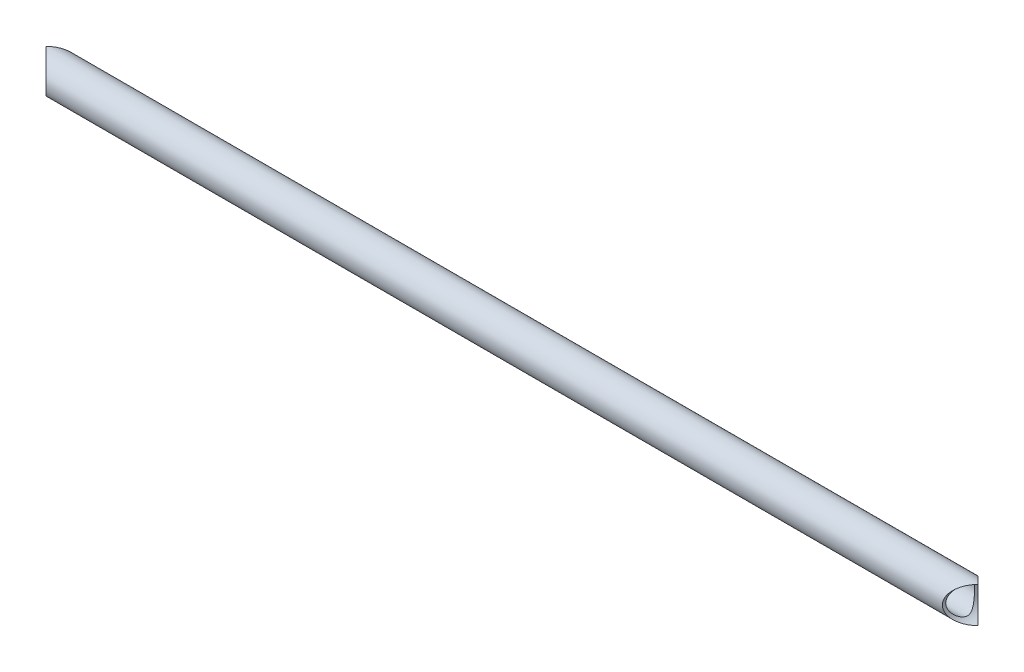
ISO-10303-21;
HEADER;
FILE_DESCRIPTION(('STEP AP214'),'2;1');
FILE_NAME('part.step','',(''),(''),'','','');
FILE_SCHEMA(('AUTOMOTIVE_DESIGN { 1 0 10303 214 1 1 1 1 }'));
ENDSEC;
DATA;
#1=APPLICATION_CONTEXT('core data for automotive mechanical design processes');
#2=APPLICATION_PROTOCOL_DEFINITION('international standard','automotive_design',2000,#1);
#3=PRODUCT_CONTEXT('',#1,'mechanical');
#4=PRODUCT('Part','Part','',(#3));
#5=PRODUCT_RELATED_PRODUCT_CATEGORY('part','',(#4));
#6=PRODUCT_DEFINITION_FORMATION('','',#4);
#7=PRODUCT_DEFINITION_CONTEXT('part definition',#1,'design');
#8=PRODUCT_DEFINITION('design','',#6,#7);
#9=PRODUCT_DEFINITION_SHAPE('','',#8);
#10=(LENGTH_UNIT() NAMED_UNIT(*) SI_UNIT(.MILLI.,.METRE.));
#11=(NAMED_UNIT(*) PLANE_ANGLE_UNIT() SI_UNIT($,.RADIAN.));
#12=(NAMED_UNIT(*) SI_UNIT($,.STERADIAN.) SOLID_ANGLE_UNIT());
#13=UNCERTAINTY_MEASURE_WITH_UNIT(LENGTH_MEASURE(1.E-05),#10,'distance_accuracy_value','');
#14=(GEOMETRIC_REPRESENTATION_CONTEXT(3) GLOBAL_UNCERTAINTY_ASSIGNED_CONTEXT((#13)) GLOBAL_UNIT_ASSIGNED_CONTEXT((#10,
#11,#12)) REPRESENTATION_CONTEXT('',''));
#15=CARTESIAN_POINT('',(0.,0.,0.));
#16=DIRECTION('',(0.,0.,1.));
#17=DIRECTION('',(1.,0.,0.));
#18=AXIS2_PLACEMENT_3D('',#15,#16,#17);
#19=CARTESIAN_POINT('',(473.575059000242,250.,150.));
#20=DIRECTION('',(-1.,0.,0.));
#21=DIRECTION('',(0.,0.,1.));
#22=AXIS2_PLACEMENT_3D('',#19,#20,#21);
#23=CYLINDRICAL_SURFACE('',#22,7.93750000000001);
#24=CARTESIAN_POINT('',(58.5315782487256,250.,150.));
#25=DIRECTION('',(-0.707106781186548,0.,0.707106781186547));
#26=DIRECTION('',(-0.707106781186547,0.,-0.707106781186547));
#27=AXIS2_PLACEMENT_3D('',#24,#25,#26);
#28=ELLIPSE('',#27,11.2253201513364,7.9375);
#29=CARTESIAN_POINT('',(58.5315782487256,242.0625,150.));
#30=VERTEX_POINT('',#29);
#31=CARTESIAN_POINT('',(58.5315782487256,257.9375,150.));
#32=VERTEX_POINT('',#31);
#33=EDGE_CURVE('E72',#30,#32,#28,.T.);
#34=ORIENTED_EDGE('',*,*,#33,.F.);
#35=CARTESIAN_POINT('',(58.5315782487256,250.,150.));
#36=DIRECTION('',(-0.707106781186547,0.,-0.707106781186547));
#37=DIRECTION('',(-0.707106781186548,0.,0.707106781186547));
#38=AXIS2_PLACEMENT_3D('',#35,#36,#37);
#39=ELLIPSE('',#38,11.2253201513364,7.9375);
#40=EDGE_CURVE('E75',#32,#30,#39,.T.);
#41=ORIENTED_EDGE('',*,*,#40,.F.);
#42=EDGE_LOOP('',(#34,#41));
#43=FACE_BOUND('',#42,.T.);
#44=CARTESIAN_POINT('',(473.575059000242,250.,150.));
#45=DIRECTION('',(-0.707106781186547,0.,-0.707106781186547));
#46=DIRECTION('',(-0.707106781186548,0.,0.707106781186547));
#47=AXIS2_PLACEMENT_3D('',#44,#45,#46);
#48=ELLIPSE('',#47,11.2253201513364,7.93749999999999);
#49=CARTESIAN_POINT('',(473.575059000242,257.9375,150.));
#50=VERTEX_POINT('',#49);
#51=CARTESIAN_POINT('',(473.575059000242,242.0625,150.));
#52=VERTEX_POINT('',#51);
#53=EDGE_CURVE('E56',#50,#52,#48,.F.);
#54=ORIENTED_EDGE('',*,*,#53,.F.);
#55=CARTESIAN_POINT('',(473.575059000242,250.,150.));
#56=DIRECTION('',(-0.707106781186548,0.,0.707106781186547));
#57=DIRECTION('',(-0.707106781186547,0.,-0.707106781186547));
#58=AXIS2_PLACEMENT_3D('',#55,#56,#57);
#59=ELLIPSE('',#58,11.2253201513364,7.93749999999999);
#60=EDGE_CURVE('E64',#52,#50,#59,.F.);
#61=ORIENTED_EDGE('',*,*,#60,.F.);
#62=EDGE_LOOP('',(#54,#61));
#63=FACE_BOUND('',#62,.T.);
#64=ADVANCED_FACE('F43',(#43,#63),#23,.T.);
#65=CARTESIAN_POINT('',(58.5315782487256,250.,142.0625));
#66=DIRECTION('',(0.,0.,-1.));
#67=DIRECTION('',(-1.,0.,0.));
#68=AXIS2_PLACEMENT_3D('',#65,#66,#67);
#69=CYLINDRICAL_SURFACE('',#68,7.93749999999999);
#70=CARTESIAN_POINT('',(66.4690782487256,250.,156.4375));
#71=CARTESIAN_POINT('',(66.4690788460228,250.154053503878,156.437500608444));
#72=CARTESIAN_POINT('',(66.4645847339768,250.308099275992,156.431961861972));
#73=CARTESIAN_POINT('',(66.4467142619706,250.614941540752,156.409907964997));
#74=CARTESIAN_POINT('',(66.433334556245,250.767737540864,156.393388679899));
#75=CARTESIAN_POINT('',(66.3979815952464,251.070948446745,156.349643097306));
#76=CARTESIAN_POINT('',(66.3759986966101,251.221360482769,156.322404784608));
#77=CARTESIAN_POINT('',(66.3239195371053,251.518586125078,156.257671431219));
#78=CARTESIAN_POINT('',(66.2938195983297,251.665398067148,156.220171740889));
#79=CARTESIAN_POINT('',(66.2263602235137,251.953449267325,156.135781077952));
#80=CARTESIAN_POINT('',(66.1890511531619,252.094719448489,156.088955195595));
#81=CARTESIAN_POINT('',(66.1077471609762,252.372022320857,155.986385089181));
#82=CARTESIAN_POINT('',(66.0637493244889,252.508052696251,155.930636976669));
#83=CARTESIAN_POINT('',(65.9228539220107,252.907302010115,155.75100221247));
#84=CARTESIAN_POINT('',(65.8169932228406,253.16193206833,155.614649482006));
#85=CARTESIAN_POINT('',(65.6247658528365,253.567010929785,155.362381999194));
#86=CARTESIAN_POINT('',(65.5430962417019,253.724607397373,155.254021151704));
#87=CARTESIAN_POINT('',(65.3735796535906,254.027529423989,155.025570265578));
#88=CARTESIAN_POINT('',(65.2857328691625,254.172855365191,154.905480592497));
#89=CARTESIAN_POINT('',(65.1055134536101,254.451392250007,154.65422539196));
#90=CARTESIAN_POINT('',(65.0131288824604,254.584568272048,154.523029906114));
#91=CARTESIAN_POINT('',(64.8260038527136,254.838279289999,154.250542275349));
#92=CARTESIAN_POINT('',(64.7312636735601,254.958815776558,154.109251324354));
#93=CARTESIAN_POINT('',(64.539921690268,255.189073760004,153.814508680505));
#94=CARTESIAN_POINT('',(64.4433150466249,255.298583011971,153.66089430524));
#95=CARTESIAN_POINT('',(64.2522673644586,255.504300509459,153.343627993682));
#96=CARTESIAN_POINT('',(64.1578270383173,255.60050443045,153.179972818737));
#97=CARTESIAN_POINT('',(63.9744268432921,255.778893983945,152.842893363623));
#98=CARTESIAN_POINT('',(63.8854531110542,255.861116098408,152.669496128005));
#99=CARTESIAN_POINT('',(63.7166535009951,256.010958511803,152.31241810528));
#100=CARTESIAN_POINT('',(63.6368197795186,256.078591375499,152.128746340048));
#101=CARTESIAN_POINT('',(63.481587311345,256.205858825104,151.725932449178));
#102=CARTESIAN_POINT('',(63.408131561222,256.263293117879,151.50529171368));
#103=CARTESIAN_POINT('',(63.3179840314675,256.33211340765,151.165793962177));
#104=CARTESIAN_POINT('',(63.2912855958815,256.352157205264,151.051286247496));
#105=CARTESIAN_POINT('',(63.245584710499,256.386146122896,150.819877384729));
#106=CARTESIAN_POINT('',(63.2265783382512,256.400094351548,150.702977488533));
#107=CARTESIAN_POINT('',(63.1969838489047,256.42170078256,150.466294074162));
#108=CARTESIAN_POINT('',(63.1864843987952,256.429292760756,150.346493259695));
#109=CARTESIAN_POINT('',(63.1747865106252,256.437746269686,150.106200444184));
#110=CARTESIAN_POINT('',(63.1735875044037,256.438608211556,149.985708485811));
#111=CARTESIAN_POINT('',(63.1805580365463,256.433576824116,149.745075220789));
#112=CARTESIAN_POINT('',(63.1887327280228,256.427679779109,149.62493414345));
#113=CARTESIAN_POINT('',(63.2140186153361,256.409282210686,149.386110915872));
#114=CARTESIAN_POINT('',(63.2311310352829,256.396780782732,149.267428967754));
#115=CARTESIAN_POINT('',(63.2763190982972,256.36335068114,149.016492195911));
#116=CARTESIAN_POINT('',(63.305563782482,256.341511467071,148.884570577963));
#117=CARTESIAN_POINT('',(63.3729378607734,256.290224863835,148.624473321206));
#118=CARTESIAN_POINT('',(63.4110738067781,256.260771862381,148.496300523643));
#119=CARTESIAN_POINT('',(63.4946546957883,256.194724969012,148.243910556131));
#120=CARTESIAN_POINT('',(63.5401174467303,256.158113631189,148.119703930418));
#121=CARTESIAN_POINT('',(63.6367042109484,256.07828298027,147.875770758396));
#122=CARTESIAN_POINT('',(63.6878268933585,256.035065219692,147.756043167716));
#123=CARTESIAN_POINT('',(63.8223314438727,255.918056943437,147.45930377684));
#124=CARTESIAN_POINT('',(63.9085619309991,255.84012539004,147.285207345121));
#125=CARTESIAN_POINT('',(64.0870113797337,255.670647289894,146.946973540339));
#126=CARTESIAN_POINT('',(64.1792333331748,255.579093911201,146.782841223215));
#127=CARTESIAN_POINT('',(64.3666568232606,255.382769650977,146.464146687719));
#128=CARTESIAN_POINT('',(64.4618619115611,255.277982526309,146.309596584188));
#129=CARTESIAN_POINT('',(64.6525905465105,255.055549816154,146.010316545821));
#130=CARTESIAN_POINT('',(64.7481140342483,254.937906493827,145.865584889828));
#131=CARTESIAN_POINT('',(64.9405228566732,254.685653023963,145.581476038783));
#132=CARTESIAN_POINT('',(65.0373451811362,254.550603956061,145.442444906691));
#133=CARTESIAN_POINT('',(65.2268403946601,254.266904551232,145.175808522328));
#134=CARTESIAN_POINT('',(65.3195126585865,254.1182521754,145.04820498855));
#135=CARTESIAN_POINT('',(65.4983629420249,253.807864625268,144.805746634844));
#136=CARTESIAN_POINT('',(65.5845547536262,253.646158847191,144.690864478882));
#137=CARTESIAN_POINT('',(65.7485131792582,253.30979203333,144.474913242696));
#138=CARTESIAN_POINT('',(65.8262833697086,253.135136550421,144.373838294143));
#139=CARTESIAN_POINT('',(65.9510335484194,252.824061773107,144.213151946126));
#140=CARTESIAN_POINT('',(66.0005524189401,252.690559949619,144.149837473599));
#141=CARTESIAN_POINT('',(66.0932910798063,252.417675878495,144.031890582919));
#142=CARTESIAN_POINT('',(66.1365124249376,252.278295093302,143.977256021495));
#143=CARTESIAN_POINT('',(66.2158682583945,251.994321060996,143.877359002812));
#144=CARTESIAN_POINT('',(66.2520060660857,251.849730293081,143.832092155259));
#145=CARTESIAN_POINT('',(66.3165067778776,251.556080853704,143.751544631935));
#146=CARTESIAN_POINT('',(66.3448695017954,251.407022078788,143.716264187592));
#147=CARTESIAN_POINT('',(66.3933524618326,251.10454086576,143.656080551621));
#148=CARTESIAN_POINT('',(66.4134222488414,250.95109761985,143.631240859786));
#149=CARTESIAN_POINT('',(66.4446052266157,250.641910788222,143.592689744197));
#150=CARTESIAN_POINT('',(66.4557184252481,250.486167204525,143.578978310668));
#151=CARTESIAN_POINT('',(66.4687162118287,250.173742475161,143.562944686143));
#152=CARTESIAN_POINT('',(66.4706027895845,250.017061538941,143.560620039479));
#153=CARTESIAN_POINT('',(66.4651049835462,249.704117727591,143.567399382574));
#154=CARTESIAN_POINT('',(66.4577212091488,249.547854825657,143.576502621109));
#155=CARTESIAN_POINT('',(66.4349779266729,249.251556716677,143.604588646214));
#156=CARTESIAN_POINT('',(66.420423450031,249.111363064157,143.622574611505));
#157=CARTESIAN_POINT('',(66.3841218089156,248.833325557361,143.667534746147));
#158=CARTESIAN_POINT('',(66.3623722518012,248.695482500803,143.694511905438));
#159=CARTESIAN_POINT('',(66.3120917245188,248.423076226467,143.757065038265));
#160=CARTESIAN_POINT('',(66.2835629882861,248.288511944309,143.792638179242));
#161=CARTESIAN_POINT('',(66.2202184598146,248.023300674713,143.871929162642));
#162=CARTESIAN_POINT('',(66.1854002990705,247.892655184722,143.915650073595));
#163=CARTESIAN_POINT('',(66.0687531778717,247.495349160689,144.062809396198));
#164=CARTESIAN_POINT('',(65.9771605035872,247.236221002269,144.179258803792));
#165=CARTESIAN_POINT('',(65.7743335427632,246.741456744872,144.441054910504));
#166=CARTESIAN_POINT('',(65.6630862932325,246.505836311668,144.586420689162));
#167=CARTESIAN_POINT('',(65.4591651458261,246.121086306473,144.858533635711));
#168=CARTESIAN_POINT('',(65.3697859397222,245.965979718342,144.979423050107));
#169=CARTESIAN_POINT('',(65.1857779175069,245.669179061505,145.233082052683));
#170=CARTESIAN_POINT('',(65.0911490587832,245.527485101696,145.365851737302));
#171=CARTESIAN_POINT('',(64.8985664731507,245.257326528774,145.642711861469));
#172=CARTESIAN_POINT('',(64.8006056341704,245.128892926884,145.786827508416));
#173=CARTESIAN_POINT('',(64.6038495426285,244.885719152577,146.085586559862));
#174=CARTESIAN_POINT('',(64.5050544935787,244.77097573811,146.240227458138));
#175=CARTESIAN_POINT('',(64.3237747502903,244.571396110627,146.536102212587));
#176=CARTESIAN_POINT('',(64.2410512450514,244.484650519112,146.675905307975));
#177=CARTESIAN_POINT('',(64.0787238280833,244.321415264178,146.963162232371));
#178=CARTESIAN_POINT('',(63.9991203394299,244.244926988274,147.110617092706));
#179=CARTESIAN_POINT('',(63.8455326116583,244.102821757114,147.413009477528));
#180=CARTESIAN_POINT('',(63.7715352062612,244.037178873221,147.567927977339));
#181=CARTESIAN_POINT('',(63.6318527112706,243.917272604688,147.885602428293));
#182=CARTESIAN_POINT('',(63.5661628060655,243.86300261542,148.048353762729));
#183=CARTESIAN_POINT('',(63.4296431246504,243.753194194026,148.428952494324));
#184=CARTESIAN_POINT('',(63.362579689462,243.701606343269,148.64940369867));
#185=CARTESIAN_POINT('',(63.2828994716648,243.641544526172,148.987781714222));
#186=CARTESIAN_POINT('',(63.2598325847465,243.624415527955,149.101789236112));
#187=CARTESIAN_POINT('',(63.2215786547397,243.596222100269,149.331838396907));
#188=CARTESIAN_POINT('',(63.2063877273223,243.585154681149,149.44787900387));
#189=CARTESIAN_POINT('',(63.1845121201748,243.569269073924,149.682180246307));
#190=CARTESIAN_POINT('',(63.1778998770396,243.56450409582,149.800451339474));
#191=CARTESIAN_POINT('',(63.1737627482403,243.561519092758,150.037233968951));
#192=CARTESIAN_POINT('',(63.1762375257155,243.563298825185,150.155745496185));
#193=CARTESIAN_POINT('',(63.1901479223808,243.573359614817,150.392039973069));
#194=CARTESIAN_POINT('',(63.2015898927771,243.581645279997,150.509822346663));
#195=CARTESIAN_POINT('',(63.2328681517166,243.604521088464,150.743689789428));
#196=CARTESIAN_POINT('',(63.2527090272591,243.619114676868,150.859773895209));
#197=CARTESIAN_POINT('',(63.3044839670649,243.657720293088,151.111826220293));
#198=CARTESIAN_POINT('',(63.3380199582106,243.683012459214,151.247268171872));
#199=CARTESIAN_POINT('',(63.4140054917185,243.741557392194,151.513923892147));
#200=CARTESIAN_POINT('',(63.45646205718,243.774816434215,151.645134234883));
#201=CARTESIAN_POINT('',(63.5485594996131,243.848797011514,151.903200724185));
#202=CARTESIAN_POINT('',(63.5982177869175,243.889536696825,152.030045369799));
#203=CARTESIAN_POINT('',(63.7029621990228,243.977924407442,152.278913314768));
#204=CARTESIAN_POINT('',(63.7580469043202,244.025570627588,152.40093786338));
#205=CARTESIAN_POINT('',(63.9014864780529,244.153518387237,152.701624714565));
#206=CARTESIAN_POINT('',(63.9924253667878,244.238042179885,152.877267498439));
#207=CARTESIAN_POINT('',(64.1794653749015,244.421250233546,153.218138678327));
#208=CARTESIAN_POINT('',(64.2755689274258,244.51994120616,153.383362084534));
#209=CARTESIAN_POINT('',(64.4699100890221,244.731153472898,153.703714846521));
#210=CARTESIAN_POINT('',(64.5681499953392,244.843690329446,153.858832538752));
#211=CARTESIAN_POINT('',(64.7640591236653,245.082285014452,154.158626674223));
#212=CARTESIAN_POINT('',(64.8617284420099,245.208340486584,154.303304929751));
#213=CARTESIAN_POINT('',(65.0566447964301,245.477206001213,154.585260944363));
#214=CARTESIAN_POINT('',(65.1538212474684,245.620354111429,154.722266072264));
#215=CARTESIAN_POINT('',(65.3429551750259,245.920716836231,154.984027982882));
#216=CARTESIAN_POINT('',(65.4349117797274,246.07793378936,155.108782722065));
#217=CARTESIAN_POINT('',(65.6111364433749,246.405792922136,155.344506764618));
#218=CARTESIAN_POINT('',(65.6954213963834,246.576403981817,155.45550656338));
#219=CARTESIAN_POINT('',(65.8542371163664,246.930762706863,155.662440218374));
#220=CARTESIAN_POINT('',(65.9287731032693,247.114503260076,155.758382142652));
#221=CARTESIAN_POINT('',(66.0447848681624,247.435783870791,155.906537825633));
#222=CARTESIAN_POINT('',(66.0893858776796,247.57019373361,155.963134524704));
#223=CARTESIAN_POINT('',(66.1720814665017,247.844288584194,156.067603299422));
#224=CARTESIAN_POINT('',(66.2101777184526,247.983972204538,156.11547761817));
#225=CARTESIAN_POINT('',(66.2791109821099,248.267685451375,156.201809207691));
#226=CARTESIAN_POINT('',(66.3099610478526,248.411706726981,156.240283417905));
#227=CARTESIAN_POINT('',(66.3638686034844,248.703417420287,156.307350475281));
#228=CARTESIAN_POINT('',(66.3869287158914,248.851105585504,156.335946647994));
#229=CARTESIAN_POINT('',(66.4267276119614,249.164551319226,156.385226542622));
#230=CARTESIAN_POINT('',(66.4425694648162,249.330601884134,156.404790422698));
#231=CARTESIAN_POINT('',(66.4637457970648,249.664437735419,156.430928475545));
#232=CARTESIAN_POINT('',(66.4690775982213,249.832223453011,156.437499337355));
#233=CARTESIAN_POINT('',(66.4690782487256,250.,156.4375));
#234=B_SPLINE_CURVE_WITH_KNOTS('',3,(#70,#71,#72,#73,#74,#75,#76,#77,#78,#79,#80,#81,#82,#83,
#84,#85,#86,#87,#88,#89,#90,#91,#92,#93,#94,#95,#96,#97,#98,#99,#100,#101,#102,#103,#104,#105,
#106,#107,#108,#109,#110,#111,#112,#113,#114,#115,#116,#117,#118,#119,#120,#121,#122,#123,#124,
#125,#126,#127,#128,#129,#130,#131,#132,#133,#134,#135,#136,#137,#138,#139,#140,#141,#142,#143,
#144,#145,#146,#147,#148,#149,#150,#151,#152,#153,#154,#155,#156,#157,#158,#159,#160,#161,#162,
#163,#164,#165,#166,#167,#168,#169,#170,#171,#172,#173,#174,#175,#176,#177,#178,#179,#180,#181,
#182,#183,#184,#185,#186,#187,#188,#189,#190,#191,#192,#193,#194,#195,#196,#197,#198,#199,#200,
#201,#202,#203,#204,#205,#206,#207,#208,#209,#210,#211,#212,#213,#214,#215,#216,#217,#218,#219,
#220,#221,#222,#223,#224,#225,#226,#227,#228,#229,#230,#231,#232,#233),.UNSPECIFIED.,.T.,.F.,(4,
2,2,2,2,2,2,2,2,2,2,2,2,2,2,2,2,2,2,2,2,2,2,2,2,2,2,2,2,2,2,2,2,2,2,2,2,2,2,2,2,2,2,2,2,2,2,2,2,
2,2,2,2,2,2,2,2,2,2,2,2,2,2,2,2,2,2,2,2,2,2,2,2,2,2,2,2,2,2,2,2,4),(0.,0.461983804893522,
0.924141663037797,1.38681904691487,1.84970642754534,2.30946976195325,2.76943401716169,
3.68855815609815,4.31176065043689,4.93494372754674,5.5598649791528,6.18471244733904,
6.81991133646268,7.45531619662536,8.08903680654515,8.72220943601933,9.43812738361896,
9.79559921838151,10.1528885354108,10.5138556034541,10.8748006199652,11.2359441581722,
11.5971371715183,12.0071413632325,12.4174486439691,12.8287686563464,13.2399921562754,
13.8670458475502,14.4944151006162,15.1225620117486,15.7505985237143,16.3998516717725,
17.0492022917971,17.6971293237189,18.3447801116172,18.8118456346529,19.2787956485427,
19.7455263224607,20.2122678116673,20.6818082883572,21.1513483526328,21.620787151708,
22.0901950933262,22.515976920662,22.9419004793907,23.367683878171,23.7936279563192,
24.6854741328244,25.5779107290332,26.2251517033761,26.8723979322329,27.5211250939666,
28.1696983207219,28.7217289303695,29.2738341384586,29.8245996772343,30.375044475733,
31.0805742266781,31.4329286227946,31.7851090762431,32.1402443178904,32.4953663946205,
32.8507402217214,33.2063083844892,33.6310660160363,34.0561593174991,34.4822979741033,
34.9083254510944,35.5526662184164,36.1973132512345,36.842691586297,37.4879576126269,
38.1492313691107,38.810615248394,39.4705055253032,40.1300410153282,40.5871349208617,
41.0441111107938,41.5002576314255,41.9562504351791,42.4592594650595,42.9623966582976),.UNSPECIFIED.);
#235=CARTESIAN_POINT('',(66.4690782487256,250.,156.4375));
#236=VERTEX_POINT('',#235);
#237=EDGE_CURVE('E79',#236,#236,#234,.T.);
#238=ORIENTED_EDGE('',*,*,#237,.F.);
#239=EDGE_LOOP('',(#238));
#240=FACE_BOUND('',#239,.T.);
#241=ORIENTED_EDGE('',*,*,#40,.T.);
#242=ORIENTED_EDGE('',*,*,#33,.T.);
#243=EDGE_LOOP('',(#241,#242));
#244=FACE_BOUND('',#243,.T.);
#245=ADVANCED_FACE('F74',(#240,#244),#69,.F.);
#246=CARTESIAN_POINT('',(473.575059000242,250.,142.0625));
#247=DIRECTION('',(0.,0.,-1.));
#248=DIRECTION('',(-1.,0.,0.));
#249=AXIS2_PLACEMENT_3D('',#246,#247,#248);
#250=CYLINDRICAL_SURFACE('',#249,7.93749999999998);
#251=CARTESIAN_POINT('',(465.637559000242,250.,156.4375));
#252=CARTESIAN_POINT('',(465.637558402945,249.845946496122,156.437500608444));
#253=CARTESIAN_POINT('',(465.642052514991,249.691900724008,156.431961861972));
#254=CARTESIAN_POINT('',(465.659922986997,249.385058459248,156.409907964997));
#255=CARTESIAN_POINT('',(465.673302692723,249.232262459136,156.393388679899));
#256=CARTESIAN_POINT('',(465.708655653721,248.929051553255,156.349643097306));
#257=CARTESIAN_POINT('',(465.730638552357,248.778639517231,156.322404784608));
#258=CARTESIAN_POINT('',(465.782717711862,248.481413874922,156.257671431219));
#259=CARTESIAN_POINT('',(465.812817650638,248.334601932852,156.220171740889));
#260=CARTESIAN_POINT('',(465.880277025454,248.046550732674,156.135781077952));
#261=CARTESIAN_POINT('',(465.917586095806,247.905280551511,156.088955195595));
#262=CARTESIAN_POINT('',(465.998890087991,247.627977679143,155.986385089181));
#263=CARTESIAN_POINT('',(466.042887924479,247.491947303749,155.930636976669));
#264=CARTESIAN_POINT('',(466.183783326957,247.092697989884,155.75100221247));
#265=CARTESIAN_POINT('',(466.289644026127,246.83806793167,155.614649482006));
#266=CARTESIAN_POINT('',(466.481871396131,246.432989070215,155.362381999194));
#267=CARTESIAN_POINT('',(466.563541007266,246.275392602627,155.254021151704));
#268=CARTESIAN_POINT('',(466.733057595377,245.972470576011,155.025570265578));
#269=CARTESIAN_POINT('',(466.820904379805,245.827144634809,154.905480592497));
#270=CARTESIAN_POINT('',(467.001123795357,245.548607749993,154.65422539196));
#271=CARTESIAN_POINT('',(467.093508366507,245.415431727952,154.523029906114));
#272=CARTESIAN_POINT('',(467.280633396254,245.161720710001,154.250542275349));
#273=CARTESIAN_POINT('',(467.375373575407,245.041184223442,154.109251324354));
#274=CARTESIAN_POINT('',(467.5667155587,244.810926239996,153.814508680505));
#275=CARTESIAN_POINT('',(467.663322202343,244.701416988029,153.66089430524));
#276=CARTESIAN_POINT('',(467.854369884509,244.495699490541,153.343627993682));
#277=CARTESIAN_POINT('',(467.94881021065,244.39949556955,153.179972818737));
#278=CARTESIAN_POINT('',(468.132210405675,244.221106016054,152.842893363623));
#279=CARTESIAN_POINT('',(468.221184137913,244.138883901592,152.669496128005));
#280=CARTESIAN_POINT('',(468.389983747972,243.989041488197,152.31241810528));
#281=CARTESIAN_POINT('',(468.469817469449,243.921408624501,152.128746340048));
#282=CARTESIAN_POINT('',(468.625049937623,243.794141174896,151.725932449178));
#283=CARTESIAN_POINT('',(468.698505687746,243.736706882121,151.50529171368));
#284=CARTESIAN_POINT('',(468.7886532175,243.66788659235,151.165793962177));
#285=CARTESIAN_POINT('',(468.815351653086,243.647842794736,151.051286247496));
#286=CARTESIAN_POINT('',(468.861052538468,243.613853877104,150.819877384729));
#287=CARTESIAN_POINT('',(468.880058910716,243.599905648452,150.702977488533));
#288=CARTESIAN_POINT('',(468.909653400063,243.57829921744,150.466294074162));
#289=CARTESIAN_POINT('',(468.920152850172,243.570707239244,150.346493259695));
#290=CARTESIAN_POINT('',(468.931850738342,243.562253730314,150.106200444184));
#291=CARTESIAN_POINT('',(468.933049744564,243.561391788444,149.985708485811));
#292=CARTESIAN_POINT('',(468.926079212421,243.566423175884,149.745075220789));
#293=CARTESIAN_POINT('',(468.917904520945,243.572320220891,149.62493414345));
#294=CARTESIAN_POINT('',(468.892618633631,243.590717789314,149.386110915872));
#295=CARTESIAN_POINT('',(468.875506213685,243.603219217268,149.267428967754));
#296=CARTESIAN_POINT('',(468.83031815067,243.63664931886,149.016492195911));
#297=CARTESIAN_POINT('',(468.801073466486,243.658488532929,148.884570577963));
#298=CARTESIAN_POINT('',(468.733699388194,243.709775136165,148.624473321206));
#299=CARTESIAN_POINT('',(468.695563442189,243.739228137619,148.496300523643));
#300=CARTESIAN_POINT('',(468.611982553179,243.805275030988,148.243910556131));
#301=CARTESIAN_POINT('',(468.566519802237,243.841886368811,148.119703930418));
#302=CARTESIAN_POINT('',(468.469933038019,243.92171701973,147.875770758396));
#303=CARTESIAN_POINT('',(468.418810355609,243.964934780308,147.756043167716));
#304=CARTESIAN_POINT('',(468.284305805095,244.081943056564,147.45930377684));
#305=CARTESIAN_POINT('',(468.198075317968,244.15987460996,147.285207345121));
#306=CARTESIAN_POINT('',(468.019625869234,244.329352710106,146.946973540339));
#307=CARTESIAN_POINT('',(467.927403915793,244.420906088799,146.782841223215));
#308=CARTESIAN_POINT('',(467.739980425707,244.617230349023,146.464146687719));
#309=CARTESIAN_POINT('',(467.644775337406,244.722017473691,146.309596584188));
#310=CARTESIAN_POINT('',(467.454046702457,244.944450183846,146.010316545821));
#311=CARTESIAN_POINT('',(467.358523214719,245.062093506173,145.865584889828));
#312=CARTESIAN_POINT('',(467.166114392294,245.314346976037,145.581476038783));
#313=CARTESIAN_POINT('',(467.069292067831,245.449396043939,145.442444906691));
#314=CARTESIAN_POINT('',(466.879796854307,245.733095448768,145.175808522327));
#315=CARTESIAN_POINT('',(466.787124590381,245.8817478246,145.04820498855));
#316=CARTESIAN_POINT('',(466.608274306943,246.192135374732,144.805746634844));
#317=CARTESIAN_POINT('',(466.522082495341,246.353841152809,144.690864478882));
#318=CARTESIAN_POINT('',(466.358124069709,246.69020796667,144.474913242696));
#319=CARTESIAN_POINT('',(466.280353879259,246.864863449579,144.373838294143));
#320=CARTESIAN_POINT('',(466.155603700548,247.175938226893,144.213151946126));
#321=CARTESIAN_POINT('',(466.106084830027,247.309440050381,144.149837473599));
#322=CARTESIAN_POINT('',(466.013346169161,247.582324121505,144.031890582919));
#323=CARTESIAN_POINT('',(465.97012482403,247.721704906698,143.977256021495));
#324=CARTESIAN_POINT('',(465.890768990573,248.005678939004,143.877359002812));
#325=CARTESIAN_POINT('',(465.854631182882,248.150269706919,143.832092155259));
#326=CARTESIAN_POINT('',(465.79013047109,248.443919146296,143.751544631935));
#327=CARTESIAN_POINT('',(465.761767747172,248.592977921212,143.716264187592));
#328=CARTESIAN_POINT('',(465.713284787135,248.89545913424,143.656080551621));
#329=CARTESIAN_POINT('',(465.693215000126,249.04890238015,143.631240859786));
#330=CARTESIAN_POINT('',(465.662032022352,249.358089211778,143.592689744197));
#331=CARTESIAN_POINT('',(465.650918823719,249.513832795475,143.578978310668));
#332=CARTESIAN_POINT('',(465.637921037139,249.826257524839,143.562944686143));
#333=CARTESIAN_POINT('',(465.636034459383,249.982938461059,143.560620039479));
#334=CARTESIAN_POINT('',(465.641532265421,250.295882272409,143.567399382574));
#335=CARTESIAN_POINT('',(465.648916039819,250.452145174343,143.576502621109));
#336=CARTESIAN_POINT('',(465.671659322295,250.748443283323,143.604588646215));
#337=CARTESIAN_POINT('',(465.686213798936,250.888636935843,143.622574611505));
#338=CARTESIAN_POINT('',(465.722515440052,251.166674442639,143.667534746147));
#339=CARTESIAN_POINT('',(465.744264997166,251.304517499197,143.694511905438));
#340=CARTESIAN_POINT('',(465.794545524449,251.576923773533,143.757065038265));
#341=CARTESIAN_POINT('',(465.823074260681,251.711488055691,143.792638179242));
#342=CARTESIAN_POINT('',(465.886418789153,251.976699325287,143.871929162642));
#343=CARTESIAN_POINT('',(465.921236949897,252.107344815278,143.915650073595));
#344=CARTESIAN_POINT('',(466.037884071096,252.504650839311,144.062809396198));
#345=CARTESIAN_POINT('',(466.12947674538,252.763778997731,144.179258803792));
#346=CARTESIAN_POINT('',(466.332303706204,253.258543255128,144.441054910504));
#347=CARTESIAN_POINT('',(466.443550955735,253.494163688332,144.586420689162));
#348=CARTESIAN_POINT('',(466.647472103141,253.878913693527,144.858533635711));
#349=CARTESIAN_POINT('',(466.736851309245,254.034020281658,144.979423050107));
#350=CARTESIAN_POINT('',(466.920859331461,254.330820938495,145.233082052683));
#351=CARTESIAN_POINT('',(467.015488190184,254.472514898304,145.365851737302));
#352=CARTESIAN_POINT('',(467.208070775817,254.742673471226,145.642711861469));
#353=CARTESIAN_POINT('',(467.306031614797,254.871107073116,145.786827508416));
#354=CARTESIAN_POINT('',(467.502787706339,255.114280847422,146.085586559862));
#355=CARTESIAN_POINT('',(467.601582755389,255.22902426189,146.240227458138));
#356=CARTESIAN_POINT('',(467.782862498677,255.428603889373,146.536102212588));
#357=CARTESIAN_POINT('',(467.865586003916,255.515349480888,146.675905307975));
#358=CARTESIAN_POINT('',(468.027913420884,255.678584735822,146.963162232371));
#359=CARTESIAN_POINT('',(468.107516909538,255.755073011726,147.110617092706));
#360=CARTESIAN_POINT('',(468.261104637309,255.897178242886,147.413009477528));
#361=CARTESIAN_POINT('',(468.335102042706,255.962821126779,147.567927977339));
#362=CARTESIAN_POINT('',(468.474784537697,256.082727395312,147.885602428293));
#363=CARTESIAN_POINT('',(468.540474442902,256.136997384581,148.048353762729));
#364=CARTESIAN_POINT('',(468.676994124317,256.246805805974,148.428952494324));
#365=CARTESIAN_POINT('',(468.744057559505,256.298393656731,148.64940369867));
#366=CARTESIAN_POINT('',(468.823737777303,256.358455473828,148.987781714222));
#367=CARTESIAN_POINT('',(468.846804664221,256.375584472045,149.101789236112));
#368=CARTESIAN_POINT('',(468.885058594228,256.403777899731,149.331838396907));
#369=CARTESIAN_POINT('',(468.900249521645,256.41484531885,149.44787900387));
#370=CARTESIAN_POINT('',(468.922125128793,256.430730926076,149.682180246307));
#371=CARTESIAN_POINT('',(468.928737371928,256.43549590418,149.800451339474));
#372=CARTESIAN_POINT('',(468.932874500727,256.438480907242,150.037233968951));
#373=CARTESIAN_POINT('',(468.930399723252,256.436701174815,150.155745496185));
#374=CARTESIAN_POINT('',(468.916489326587,256.426640385183,150.392039973069));
#375=CARTESIAN_POINT('',(468.90504735619,256.418354720003,150.509822346663));
#376=CARTESIAN_POINT('',(468.873769097251,256.395478911536,150.743689789428));
#377=CARTESIAN_POINT('',(468.853928221708,256.380885323132,150.859773895209));
#378=CARTESIAN_POINT('',(468.802153281903,256.342279706912,151.111826220293));
#379=CARTESIAN_POINT('',(468.768617290757,256.316987540786,151.247268171872));
#380=CARTESIAN_POINT('',(468.692631757249,256.258442607806,151.513923892147));
#381=CARTESIAN_POINT('',(468.650175191788,256.225183565785,151.645134234883));
#382=CARTESIAN_POINT('',(468.558077749354,256.151202988486,151.903200724185));
#383=CARTESIAN_POINT('',(468.50841946205,256.110463303175,152.030045369799));
#384=CARTESIAN_POINT('',(468.403675049945,256.022075592558,152.278913314768));
#385=CARTESIAN_POINT('',(468.348590344647,255.974429372412,152.40093786338));
#386=CARTESIAN_POINT('',(468.205150770915,255.846481612763,152.701624714564));
#387=CARTESIAN_POINT('',(468.11421188218,255.761957820115,152.877267498439));
#388=CARTESIAN_POINT('',(467.927171874066,255.578749766454,153.218138678327));
#389=CARTESIAN_POINT('',(467.831068321542,255.48005879384,153.383362084534));
#390=CARTESIAN_POINT('',(467.636727159945,255.268846527102,153.703714846521));
#391=CARTESIAN_POINT('',(467.538487253628,255.156309670554,153.858832538752));
#392=CARTESIAN_POINT('',(467.342578125302,254.917714985548,154.158626674223));
#393=CARTESIAN_POINT('',(467.244908806958,254.791659513416,154.303304929751));
#394=CARTESIAN_POINT('',(467.049992452538,254.522793998787,154.585260944363));
#395=CARTESIAN_POINT('',(466.952816001499,254.379645888571,154.722266072264));
#396=CARTESIAN_POINT('',(466.763682073942,254.07928316377,154.984027982881));
#397=CARTESIAN_POINT('',(466.67172546924,253.92206621064,155.108782722065));
#398=CARTESIAN_POINT('',(466.495500805593,253.594207077865,155.344506764618));
#399=CARTESIAN_POINT('',(466.411215852584,253.423596018183,155.45550656338));
#400=CARTESIAN_POINT('',(466.252400132601,253.069237293137,155.662440218374));
#401=CARTESIAN_POINT('',(466.177864145698,252.885496739924,155.758382142652));
#402=CARTESIAN_POINT('',(466.061852380805,252.564216129209,155.906537825633));
#403=CARTESIAN_POINT('',(466.017251371288,252.42980626639,155.963134524704));
#404=CARTESIAN_POINT('',(465.934555782466,252.155711415807,156.067603299421));
#405=CARTESIAN_POINT('',(465.896459530515,252.016027795462,156.11547761817));
#406=CARTESIAN_POINT('',(465.827526266858,251.732314548625,156.201809207691));
#407=CARTESIAN_POINT('',(465.796676201115,251.588293273019,156.240283417905));
#408=CARTESIAN_POINT('',(465.742768645483,251.296582579713,156.307350475281));
#409=CARTESIAN_POINT('',(465.719708533076,251.148894414496,156.335946647994));
#410=CARTESIAN_POINT('',(465.679909637006,250.835448680774,156.385226542622));
#411=CARTESIAN_POINT('',(465.664067784151,250.669398115866,156.404790422698));
#412=CARTESIAN_POINT('',(465.642891451903,250.335562264581,156.430928475545));
#413=CARTESIAN_POINT('',(465.637559650746,250.167776546989,156.437499337356));
#414=CARTESIAN_POINT('',(465.637559000242,250.,156.4375));
#415=B_SPLINE_CURVE_WITH_KNOTS('',3,(#251,#252,#253,#254,#255,#256,#257,#258,#259,#260,#261,
#262,#263,#264,#265,#266,#267,#268,#269,#270,#271,#272,#273,#274,#275,#276,#277,#278,#279,#280,
#281,#282,#283,#284,#285,#286,#287,#288,#289,#290,#291,#292,#293,#294,#295,#296,#297,#298,#299,
#300,#301,#302,#303,#304,#305,#306,#307,#308,#309,#310,#311,#312,#313,#314,#315,#316,#317,#318,
#319,#320,#321,#322,#323,#324,#325,#326,#327,#328,#329,#330,#331,#332,#333,#334,#335,#336,#337,
#338,#339,#340,#341,#342,#343,#344,#345,#346,#347,#348,#349,#350,#351,#352,#353,#354,#355,#356,
#357,#358,#359,#360,#361,#362,#363,#364,#365,#366,#367,#368,#369,#370,#371,#372,#373,#374,#375,
#376,#377,#378,#379,#380,#381,#382,#383,#384,#385,#386,#387,#388,#389,#390,#391,#392,#393,#394,
#395,#396,#397,#398,#399,#400,#401,#402,#403,#404,#405,#406,#407,#408,#409,#410,#411,#412,#413,
#414),.UNSPECIFIED.,.T.,.F.,(4,2,2,2,2,2,2,2,2,2,2,2,2,2,2,2,2,2,2,2,2,2,2,2,2,2,2,2,2,2,2,2,2,
2,2,2,2,2,2,2,2,2,2,2,2,2,2,2,2,2,2,2,2,2,2,2,2,2,2,2,2,2,2,2,2,2,2,2,2,2,2,2,2,2,2,2,2,2,2,2,2,
4),(0.,0.461983804893523,0.924141663037825,1.38681904691491,1.84970642754537,2.30946976195327,
2.76943401716177,3.68855815609817,4.31176065043697,4.93494372754679,5.55986497915287,
6.1847124473391,6.81991133646276,7.45531619662541,8.08903680654526,8.72220943601939,
9.43812738361899,9.79559921838153,10.1528885354109,10.5138556034542,10.8748006199652,
11.2359441581722,11.5971371715183,12.0071413632326,12.4174486439692,12.8287686563465,
13.2399921562755,13.8670458475503,14.4944151006163,15.1225620117486,15.7505985237144,
16.3998516717726,17.0492022917972,17.697129323719,18.3447801116173,18.811845634653,
19.2787956485428,19.7455263224608,20.2122678116673,20.6818082883571,21.1513483526328,
21.6207871517081,22.0901950933263,22.5159769206622,22.9419004793908,23.3676838781709,
23.7936279563192,24.6854741328244,25.5779107290332,26.2251517033762,26.8723979322329,
27.5211250939666,28.169698320722,28.7217289303695,29.2738341384586,29.8245996772343,
30.375044475733,31.0805742266781,31.4329286227946,31.7851090762431,32.1402443178904,
32.4953663946205,32.8507402217213,33.2063083844891,33.6310660160361,34.0561593174989,
34.4822979741031,34.9083254510943,35.5526662184163,36.1973132512343,36.8426915862967,
37.4879576126266,38.1492313691104,38.8106152483938,39.470505525303,40.130041015328,
40.5871349208614,41.0441111107935,41.5002576314252,41.9562504351789,42.4592594650593,
42.9623966582976),.UNSPECIFIED.);
#416=CARTESIAN_POINT('',(465.637559000242,250.,156.4375));
#417=VERTEX_POINT('',#416);
#418=EDGE_CURVE('E12',#417,#417,#415,.T.);
#419=ORIENTED_EDGE('',*,*,#418,.F.);
#420=EDGE_LOOP('',(#419));
#421=FACE_BOUND('',#420,.T.);
#422=ORIENTED_EDGE('',*,*,#53,.T.);
#423=ORIENTED_EDGE('',*,*,#60,.T.);
#424=EDGE_LOOP('',(#422,#423));
#425=FACE_BOUND('',#424,.T.);
#426=ADVANCED_FACE('F90',(#421,#425),#250,.F.);
#427=CARTESIAN_POINT('',(473.575059000242,250.,150.));
#428=DIRECTION('',(-1.,0.,0.));
#429=DIRECTION('',(0.,0.,1.));
#430=AXIS2_PLACEMENT_3D('',#427,#428,#429);
#431=CYLINDRICAL_SURFACE('',#430,6.43750000000001);
#432=ORIENTED_EDGE('',*,*,#237,.T.);
#433=EDGE_LOOP('',(#432));
#434=FACE_BOUND('',#433,.T.);
#435=ORIENTED_EDGE('',*,*,#418,.T.);
#436=EDGE_LOOP('',(#435));
#437=FACE_BOUND('',#436,.T.);
#438=ADVANCED_FACE('F45',(#434,#437),#431,.F.);
#439=CLOSED_SHELL('',(#64,#245,#426,#438));
#440=MANIFOLD_SOLID_BREP('B2',#439);
#441=ADVANCED_BREP_SHAPE_REPRESENTATION('',(#18,#440),#14);
#442=SHAPE_DEFINITION_REPRESENTATION(#9,#441);
ENDSEC;
END-ISO-10303-21;
